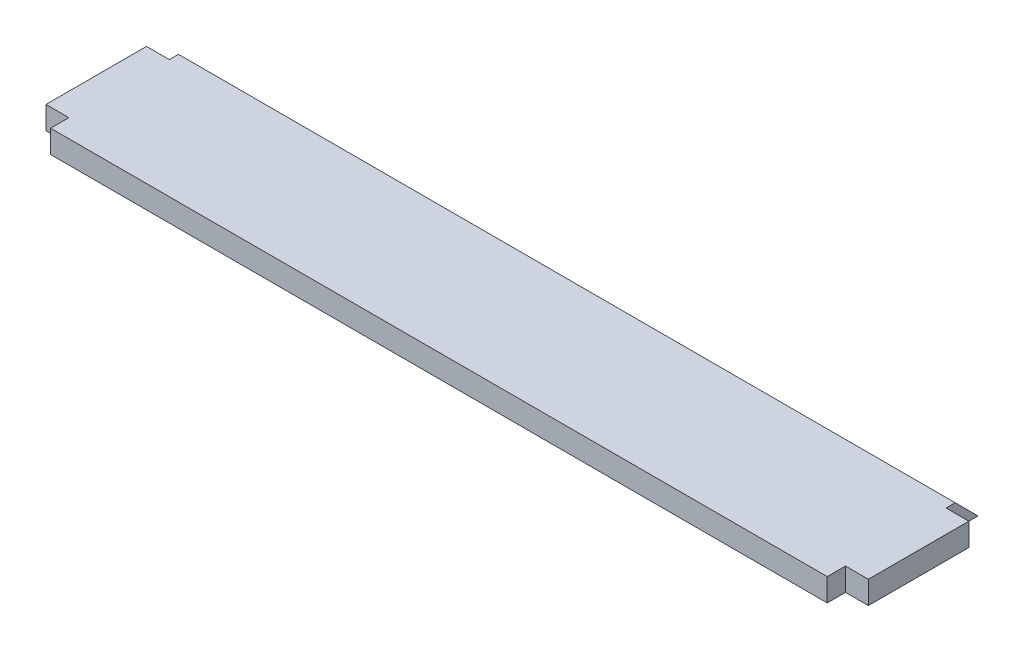
ISO-10303-21;
HEADER;
FILE_DESCRIPTION(('STEP AP214'),'2;1');
FILE_NAME('part.step','',(''),(''),'','','');
FILE_SCHEMA(('AUTOMOTIVE_DESIGN { 1 0 10303 214 1 1 1 1 }'));
ENDSEC;
DATA;
#1=APPLICATION_CONTEXT('core data for automotive mechanical design processes');
#2=APPLICATION_PROTOCOL_DEFINITION('international standard','automotive_design',2000,#1);
#3=PRODUCT_CONTEXT('',#1,'mechanical');
#4=PRODUCT('Part','Part','',(#3));
#5=PRODUCT_RELATED_PRODUCT_CATEGORY('part','',(#4));
#6=PRODUCT_DEFINITION_FORMATION('','',#4);
#7=PRODUCT_DEFINITION_CONTEXT('part definition',#1,'design');
#8=PRODUCT_DEFINITION('design','',#6,#7);
#9=PRODUCT_DEFINITION_SHAPE('','',#8);
#10=(LENGTH_UNIT() NAMED_UNIT(*) SI_UNIT(.MILLI.,.METRE.));
#11=(NAMED_UNIT(*) PLANE_ANGLE_UNIT() SI_UNIT($,.RADIAN.));
#12=(NAMED_UNIT(*) SI_UNIT($,.STERADIAN.) SOLID_ANGLE_UNIT());
#13=UNCERTAINTY_MEASURE_WITH_UNIT(LENGTH_MEASURE(1.E-05),#10,'distance_accuracy_value','');
#14=(GEOMETRIC_REPRESENTATION_CONTEXT(3) GLOBAL_UNCERTAINTY_ASSIGNED_CONTEXT((#13)) GLOBAL_UNIT_ASSIGNED_CONTEXT((#10,
#11,#12)) REPRESENTATION_CONTEXT('',''));
#15=CARTESIAN_POINT('',(0.,0.,0.));
#16=DIRECTION('',(0.,0.,1.));
#17=DIRECTION('',(1.,0.,0.));
#18=AXIS2_PLACEMENT_3D('',#15,#16,#17);
#19=CARTESIAN_POINT('',(85.,5.,-17.5));
#20=DIRECTION('',(-1.,0.,0.));
#21=DIRECTION('',(0.,0.,1.));
#22=AXIS2_PLACEMENT_3D('',#19,#20,#21);
#23=PLANE('',#22);
#24=DIRECTION('',(0.,0.,-1.));
#25=VECTOR('',#24,1.);
#26=CARTESIAN_POINT('',(85.,0.,-17.5));
#27=LINE('',#26,#25);
#28=CARTESIAN_POINT('',(85.,0.,-8.5));
#29=VERTEX_POINT('',#28);
#30=CARTESIAN_POINT('',(85.,0.,-15.5000000000001));
#31=VERTEX_POINT('',#30);
#32=EDGE_CURVE('E129',#29,#31,#27,.T.);
#33=ORIENTED_EDGE('',*,*,#32,.T.);
#34=DIRECTION('',(0.,-0.707106781186548,-0.707106781186546));
#35=VECTOR('',#34,1.);
#36=CARTESIAN_POINT('',(85.,5.,-10.5000000000001));
#37=LINE('',#36,#35);
#38=CARTESIAN_POINT('',(85.,5.,-10.5000000000001));
#39=VERTEX_POINT('',#38);
#40=EDGE_CURVE('E47',#39,#31,#37,.T.);
#41=ORIENTED_EDGE('',*,*,#40,.F.);
#42=DIRECTION('',(0.,0.,-1.));
#43=VECTOR('',#42,1.);
#44=CARTESIAN_POINT('',(85.,5.,-17.5));
#45=LINE('',#44,#43);
#46=CARTESIAN_POINT('',(85.,5.,-8.5));
#47=VERTEX_POINT('',#46);
#48=EDGE_CURVE('E54',#47,#39,#45,.T.);
#49=ORIENTED_EDGE('',*,*,#48,.F.);
#50=DIRECTION('',(0.,1.,0.));
#51=VECTOR('',#50,1.);
#52=CARTESIAN_POINT('',(85.,5.,-8.5));
#53=LINE('',#52,#51);
#54=EDGE_CURVE('E227',#29,#47,#53,.T.);
#55=ORIENTED_EDGE('',*,*,#54,.F.);
#56=EDGE_LOOP('',(#33,#41,#49,#55));
#57=FACE_BOUND('',#56,.T.);
#58=ADVANCED_FACE('F33',(#57),#23,.F.);
#59=DIRECTION('',(0.,-1.,0.));
#60=VECTOR('',#59,1.);
#61=CARTESIAN_POINT('',(85.,5.,13.5));
#62=LINE('',#61,#60);
#63=CARTESIAN_POINT('',(85.,5.,13.5));
#64=VERTEX_POINT('',#63);
#65=CARTESIAN_POINT('',(85.,0.,13.5));
#66=VERTEX_POINT('',#65);
#67=EDGE_CURVE('E229',#64,#66,#62,.T.);
#68=ORIENTED_EDGE('',*,*,#67,.F.);
#69=CARTESIAN_POINT('',(85.,5.,17.5));
#70=VERTEX_POINT('',#69);
#71=EDGE_CURVE('E135',#70,#64,#45,.T.);
#72=ORIENTED_EDGE('',*,*,#71,.F.);
#73=DIRECTION('',(0.,-1.,0.));
#74=VECTOR('',#73,1.);
#75=CARTESIAN_POINT('',(85.,5.,17.5));
#76=LINE('',#75,#74);
#77=CARTESIAN_POINT('',(85.,0.,17.5));
#78=VERTEX_POINT('',#77);
#79=EDGE_CURVE('E40',#70,#78,#76,.T.);
#80=ORIENTED_EDGE('',*,*,#79,.T.);
#81=EDGE_CURVE('E150',#78,#66,#27,.T.);
#82=ORIENTED_EDGE('',*,*,#81,.T.);
#83=EDGE_LOOP('',(#68,#72,#80,#82));
#84=FACE_BOUND('',#83,.T.);
#85=ADVANCED_FACE('F158',(#84),#23,.F.);
#86=CARTESIAN_POINT('',(-85.,5.,-17.5));
#87=DIRECTION('',(1.,0.,0.));
#88=DIRECTION('',(0.,0.,-1.));
#89=AXIS2_PLACEMENT_3D('',#86,#87,#88);
#90=PLANE('',#89);
#91=DIRECTION('',(0.,1.,0.));
#92=VECTOR('',#91,1.);
#93=CARTESIAN_POINT('',(-85.,0.,13.5));
#94=LINE('',#93,#92);
#95=CARTESIAN_POINT('',(-85.,0.,13.5));
#96=VERTEX_POINT('',#95);
#97=CARTESIAN_POINT('',(-85.,5.,13.5));
#98=VERTEX_POINT('',#97);
#99=EDGE_CURVE('E185',#96,#98,#94,.T.);
#100=ORIENTED_EDGE('',*,*,#99,.F.);
#101=DIRECTION('',(0.,0.,1.));
#102=VECTOR('',#101,1.);
#103=CARTESIAN_POINT('',(-85.,0.,-17.5));
#104=LINE('',#103,#102);
#105=CARTESIAN_POINT('',(-85.,0.,17.5));
#106=VERTEX_POINT('',#105);
#107=EDGE_CURVE('E152',#96,#106,#104,.T.);
#108=ORIENTED_EDGE('',*,*,#107,.T.);
#109=DIRECTION('',(0.,-1.,0.));
#110=VECTOR('',#109,1.);
#111=CARTESIAN_POINT('',(-85.,5.,17.5));
#112=LINE('',#111,#110);
#113=CARTESIAN_POINT('',(-85.,5.,17.5));
#114=VERTEX_POINT('',#113);
#115=EDGE_CURVE('E11',#114,#106,#112,.T.);
#116=ORIENTED_EDGE('',*,*,#115,.F.);
#117=DIRECTION('',(0.,0.,1.));
#118=VECTOR('',#117,1.);
#119=CARTESIAN_POINT('',(-85.,5.,-17.5));
#120=LINE('',#119,#118);
#121=EDGE_CURVE('E139',#98,#114,#120,.T.);
#122=ORIENTED_EDGE('',*,*,#121,.F.);
#123=EDGE_LOOP('',(#100,#108,#116,#122));
#124=FACE_BOUND('',#123,.T.);
#125=ADVANCED_FACE('F218',(#124),#90,.F.);
#126=CARTESIAN_POINT('',(-85.,5.,-10.5000000000001));
#127=VERTEX_POINT('',#126);
#128=CARTESIAN_POINT('',(-85.,5.,-8.5));
#129=VERTEX_POINT('',#128);
#130=EDGE_CURVE('E146',#127,#129,#120,.T.);
#131=ORIENTED_EDGE('',*,*,#130,.F.);
#132=DIRECTION('',(0.,-0.707106781186548,-0.707106781186547));
#133=VECTOR('',#132,1.);
#134=CARTESIAN_POINT('',(-85.,1.50000000000006,-14.0000000000001));
#135=LINE('',#134,#133);
#136=CARTESIAN_POINT('',(-85.,0.,-15.5000000000001));
#137=VERTEX_POINT('',#136);
#138=EDGE_CURVE('E122',#127,#137,#135,.T.);
#139=ORIENTED_EDGE('',*,*,#138,.T.);
#140=CARTESIAN_POINT('',(-85.,0.,-8.5));
#141=VERTEX_POINT('',#140);
#142=EDGE_CURVE('E140',#137,#141,#104,.T.);
#143=ORIENTED_EDGE('',*,*,#142,.T.);
#144=DIRECTION('',(0.,-1.,0.));
#145=VECTOR('',#144,1.);
#146=CARTESIAN_POINT('',(-85.,0.,-8.5));
#147=LINE('',#146,#145);
#148=EDGE_CURVE('E190',#129,#141,#147,.T.);
#149=ORIENTED_EDGE('',*,*,#148,.F.);
#150=EDGE_LOOP('',(#131,#139,#143,#149));
#151=FACE_BOUND('',#150,.T.);
#152=ADVANCED_FACE('F226',(#151),#90,.F.);
#153=CARTESIAN_POINT('',(-85.,5.,17.5));
#154=DIRECTION('',(0.,0.,-1.));
#155=DIRECTION('',(-1.,0.,0.));
#156=AXIS2_PLACEMENT_3D('',#153,#154,#155);
#157=PLANE('',#156);
#158=DIRECTION('',(1.,0.,0.));
#159=VECTOR('',#158,1.);
#160=CARTESIAN_POINT('',(-85.,0.,17.5));
#161=LINE('',#160,#159);
#162=EDGE_CURVE('E136',#106,#78,#161,.T.);
#163=ORIENTED_EDGE('',*,*,#162,.T.);
#164=ORIENTED_EDGE('',*,*,#79,.F.);
#165=DIRECTION('',(1.,0.,0.));
#166=VECTOR('',#165,1.);
#167=CARTESIAN_POINT('',(-85.,5.,17.5));
#168=LINE('',#167,#166);
#169=EDGE_CURVE('E148',#114,#70,#168,.T.);
#170=ORIENTED_EDGE('',*,*,#169,.F.);
#171=ORIENTED_EDGE('',*,*,#115,.T.);
#172=EDGE_LOOP('',(#163,#164,#170,#171));
#173=FACE_BOUND('',#172,.T.);
#174=ADVANCED_FACE('F242',(#173),#157,.F.);
#175=CARTESIAN_POINT('',(0.,5.,0.));
#176=DIRECTION('',(0.,1.,0.));
#177=DIRECTION('',(0.,0.,1.));
#178=AXIS2_PLACEMENT_3D('',#175,#176,#177);
#179=PLANE('',#178);
#180=DIRECTION('',(1.,0.,0.));
#181=VECTOR('',#180,1.);
#182=CARTESIAN_POINT('',(-478.,5.,-10.5000000000001));
#183=LINE('',#182,#181);
#184=EDGE_CURVE('E119',#127,#39,#183,.T.);
#185=ORIENTED_EDGE('',*,*,#184,.F.);
#186=ORIENTED_EDGE('',*,*,#130,.T.);
#187=DIRECTION('',(1.,0.,0.));
#188=VECTOR('',#187,1.);
#189=CARTESIAN_POINT('',(-90.,5.,-8.5));
#190=LINE('',#189,#188);
#191=CARTESIAN_POINT('',(-90.,5.,-8.5));
#192=VERTEX_POINT('',#191);
#193=EDGE_CURVE('E205',#192,#129,#190,.T.);
#194=ORIENTED_EDGE('',*,*,#193,.F.);
#195=DIRECTION('',(0.,0.,-1.));
#196=VECTOR('',#195,1.);
#197=CARTESIAN_POINT('',(-90.,5.,-8.5));
#198=LINE('',#197,#196);
#199=CARTESIAN_POINT('',(-90.,5.,13.5));
#200=VERTEX_POINT('',#199);
#201=EDGE_CURVE('E189',#200,#192,#198,.T.);
#202=ORIENTED_EDGE('',*,*,#201,.F.);
#203=DIRECTION('',(1.,0.,0.));
#204=VECTOR('',#203,1.);
#205=CARTESIAN_POINT('',(-90.,5.,13.5));
#206=LINE('',#205,#204);
#207=EDGE_CURVE('E144',#200,#98,#206,.T.);
#208=ORIENTED_EDGE('',*,*,#207,.T.);
#209=ORIENTED_EDGE('',*,*,#121,.T.);
#210=ORIENTED_EDGE('',*,*,#169,.T.);
#211=ORIENTED_EDGE('',*,*,#71,.T.);
#212=DIRECTION('',(-1.,0.,0.));
#213=VECTOR('',#212,1.);
#214=CARTESIAN_POINT('',(90.,5.,13.5));
#215=LINE('',#214,#213);
#216=CARTESIAN_POINT('',(90.,5.,13.5));
#217=VERTEX_POINT('',#216);
#218=EDGE_CURVE('E175',#217,#64,#215,.T.);
#219=ORIENTED_EDGE('',*,*,#218,.F.);
#220=DIRECTION('',(0.,0.,1.));
#221=VECTOR('',#220,1.);
#222=CARTESIAN_POINT('',(90.,5.,-8.5));
#223=LINE('',#222,#221);
#224=CARTESIAN_POINT('',(90.,5.,-8.5));
#225=VERTEX_POINT('',#224);
#226=EDGE_CURVE('E236',#225,#217,#223,.T.);
#227=ORIENTED_EDGE('',*,*,#226,.F.);
#228=DIRECTION('',(-1.,0.,0.));
#229=VECTOR('',#228,1.);
#230=CARTESIAN_POINT('',(90.,5.,-8.5));
#231=LINE('',#230,#229);
#232=EDGE_CURVE('E133',#225,#47,#231,.T.);
#233=ORIENTED_EDGE('',*,*,#232,.T.);
#234=ORIENTED_EDGE('',*,*,#48,.T.);
#235=EDGE_LOOP('',(#185,#186,#194,#202,#208,#209,#210,#211,#219,#227,#233,#234));
#236=FACE_BOUND('',#235,.T.);
#237=ADVANCED_FACE('F131',(#236),#179,.T.);
#238=CARTESIAN_POINT('',(0.,0.,0.));
#239=DIRECTION('',(0.,1.,0.));
#240=DIRECTION('',(0.,0.,1.));
#241=AXIS2_PLACEMENT_3D('',#238,#239,#240);
#242=PLANE('',#241);
#243=ORIENTED_EDGE('',*,*,#142,.F.);
#244=DIRECTION('',(1.,0.,0.));
#245=VECTOR('',#244,1.);
#246=CARTESIAN_POINT('',(-478.,0.,-15.5000000000001));
#247=LINE('',#246,#245);
#248=EDGE_CURVE('E125',#137,#31,#247,.T.);
#249=ORIENTED_EDGE('',*,*,#248,.T.);
#250=ORIENTED_EDGE('',*,*,#32,.F.);
#251=DIRECTION('',(-1.,0.,0.));
#252=VECTOR('',#251,1.);
#253=CARTESIAN_POINT('',(90.,0.,-8.5));
#254=LINE('',#253,#252);
#255=CARTESIAN_POINT('',(90.,0.,-8.5));
#256=VERTEX_POINT('',#255);
#257=EDGE_CURVE('E176',#256,#29,#254,.T.);
#258=ORIENTED_EDGE('',*,*,#257,.F.);
#259=DIRECTION('',(0.,0.,-1.));
#260=VECTOR('',#259,1.);
#261=CARTESIAN_POINT('',(90.,0.,-8.5));
#262=LINE('',#261,#260);
#263=CARTESIAN_POINT('',(90.,0.,13.5));
#264=VERTEX_POINT('',#263);
#265=EDGE_CURVE('E172',#264,#256,#262,.T.);
#266=ORIENTED_EDGE('',*,*,#265,.F.);
#267=DIRECTION('',(-1.,0.,0.));
#268=VECTOR('',#267,1.);
#269=CARTESIAN_POINT('',(90.,0.,13.5));
#270=LINE('',#269,#268);
#271=EDGE_CURVE('E170',#264,#66,#270,.T.);
#272=ORIENTED_EDGE('',*,*,#271,.T.);
#273=ORIENTED_EDGE('',*,*,#81,.F.);
#274=ORIENTED_EDGE('',*,*,#162,.F.);
#275=ORIENTED_EDGE('',*,*,#107,.F.);
#276=DIRECTION('',(1.,0.,0.));
#277=VECTOR('',#276,1.);
#278=CARTESIAN_POINT('',(-90.,0.,13.5));
#279=LINE('',#278,#277);
#280=CARTESIAN_POINT('',(-90.,0.,13.5));
#281=VERTEX_POINT('',#280);
#282=EDGE_CURVE('E196',#281,#96,#279,.T.);
#283=ORIENTED_EDGE('',*,*,#282,.F.);
#284=DIRECTION('',(0.,0.,1.));
#285=VECTOR('',#284,1.);
#286=CARTESIAN_POINT('',(-90.,0.,-8.5));
#287=LINE('',#286,#285);
#288=CARTESIAN_POINT('',(-90.,0.,-8.5));
#289=VERTEX_POINT('',#288);
#290=EDGE_CURVE('E194',#289,#281,#287,.T.);
#291=ORIENTED_EDGE('',*,*,#290,.F.);
#292=DIRECTION('',(1.,0.,0.));
#293=VECTOR('',#292,1.);
#294=CARTESIAN_POINT('',(-90.,0.,-8.5));
#295=LINE('',#294,#293);
#296=EDGE_CURVE('E203',#289,#141,#295,.T.);
#297=ORIENTED_EDGE('',*,*,#296,.T.);
#298=EDGE_LOOP('',(#243,#249,#250,#258,#266,#272,#273,#274,#275,#283,#291,#297));
#299=FACE_BOUND('',#298,.T.);
#300=ADVANCED_FACE('F166',(#299),#242,.F.);
#301=CARTESIAN_POINT('',(-90.,0.,13.5));
#302=DIRECTION('',(0.,0.,-1.));
#303=DIRECTION('',(0.,1.,0.));
#304=AXIS2_PLACEMENT_3D('',#301,#302,#303);
#305=PLANE('',#304);
#306=ORIENTED_EDGE('',*,*,#99,.T.);
#307=ORIENTED_EDGE('',*,*,#207,.F.);
#308=DIRECTION('',(0.,1.,0.));
#309=VECTOR('',#308,1.);
#310=CARTESIAN_POINT('',(-90.,0.,13.5));
#311=LINE('',#310,#309);
#312=EDGE_CURVE('E186',#281,#200,#311,.T.);
#313=ORIENTED_EDGE('',*,*,#312,.F.);
#314=ORIENTED_EDGE('',*,*,#282,.T.);
#315=EDGE_LOOP('',(#306,#307,#313,#314));
#316=FACE_BOUND('',#315,.T.);
#317=ADVANCED_FACE('F215',(#316),#305,.F.);
#318=CARTESIAN_POINT('',(-90.,0.,-8.5));
#319=DIRECTION('',(0.,0.,1.));
#320=DIRECTION('',(1.,0.,0.));
#321=AXIS2_PLACEMENT_3D('',#318,#319,#320);
#322=PLANE('',#321);
#323=ORIENTED_EDGE('',*,*,#148,.T.);
#324=ORIENTED_EDGE('',*,*,#296,.F.);
#325=DIRECTION('',(0.,-1.,0.));
#326=VECTOR('',#325,1.);
#327=CARTESIAN_POINT('',(-90.,0.,-8.5));
#328=LINE('',#327,#326);
#329=EDGE_CURVE('E192',#192,#289,#328,.T.);
#330=ORIENTED_EDGE('',*,*,#329,.F.);
#331=ORIENTED_EDGE('',*,*,#193,.T.);
#332=EDGE_LOOP('',(#323,#324,#330,#331));
#333=FACE_BOUND('',#332,.T.);
#334=ADVANCED_FACE('F223',(#333),#322,.F.);
#335=CARTESIAN_POINT('',(-90.,0.,0.));
#336=DIRECTION('',(1.,0.,0.));
#337=DIRECTION('',(0.,0.,-1.));
#338=AXIS2_PLACEMENT_3D('',#335,#336,#337);
#339=PLANE('',#338);
#340=ORIENTED_EDGE('',*,*,#312,.T.);
#341=ORIENTED_EDGE('',*,*,#201,.T.);
#342=ORIENTED_EDGE('',*,*,#329,.T.);
#343=ORIENTED_EDGE('',*,*,#290,.T.);
#344=EDGE_LOOP('',(#340,#341,#342,#343));
#345=FACE_BOUND('',#344,.T.);
#346=ADVANCED_FACE('F221',(#345),#339,.F.);
#347=CARTESIAN_POINT('',(90.,5.,-8.5));
#348=DIRECTION('',(0.,0.,1.));
#349=DIRECTION('',(1.,0.,0.));
#350=AXIS2_PLACEMENT_3D('',#347,#348,#349);
#351=PLANE('',#350);
#352=ORIENTED_EDGE('',*,*,#54,.T.);
#353=ORIENTED_EDGE('',*,*,#232,.F.);
#354=DIRECTION('',(0.,1.,0.));
#355=VECTOR('',#354,1.);
#356=CARTESIAN_POINT('',(90.,5.,-8.5));
#357=LINE('',#356,#355);
#358=EDGE_CURVE('E233',#256,#225,#357,.T.);
#359=ORIENTED_EDGE('',*,*,#358,.F.);
#360=ORIENTED_EDGE('',*,*,#257,.T.);
#361=EDGE_LOOP('',(#352,#353,#359,#360));
#362=FACE_BOUND('',#361,.T.);
#363=ADVANCED_FACE('F309',(#362),#351,.F.);
#364=CARTESIAN_POINT('',(90.,5.,13.5));
#365=DIRECTION('',(0.,0.,-1.));
#366=DIRECTION('',(-1.,0.,0.));
#367=AXIS2_PLACEMENT_3D('',#364,#365,#366);
#368=PLANE('',#367);
#369=ORIENTED_EDGE('',*,*,#67,.T.);
#370=ORIENTED_EDGE('',*,*,#271,.F.);
#371=DIRECTION('',(0.,-1.,0.));
#372=VECTOR('',#371,1.);
#373=CARTESIAN_POINT('',(90.,5.,13.5));
#374=LINE('',#373,#372);
#375=EDGE_CURVE('E238',#217,#264,#374,.T.);
#376=ORIENTED_EDGE('',*,*,#375,.F.);
#377=ORIENTED_EDGE('',*,*,#218,.T.);
#378=EDGE_LOOP('',(#369,#370,#376,#377));
#379=FACE_BOUND('',#378,.T.);
#380=ADVANCED_FACE('F240',(#379),#368,.F.);
#381=CARTESIAN_POINT('',(90.,0.,0.));
#382=DIRECTION('',(-1.,0.,0.));
#383=DIRECTION('',(0.,0.,1.));
#384=AXIS2_PLACEMENT_3D('',#381,#382,#383);
#385=PLANE('',#384);
#386=ORIENTED_EDGE('',*,*,#358,.T.);
#387=ORIENTED_EDGE('',*,*,#226,.T.);
#388=ORIENTED_EDGE('',*,*,#375,.T.);
#389=ORIENTED_EDGE('',*,*,#265,.T.);
#390=EDGE_LOOP('',(#386,#387,#388,#389));
#391=FACE_BOUND('',#390,.T.);
#392=ADVANCED_FACE('F294',(#391),#385,.F.);
#393=CARTESIAN_POINT('',(-478.,5.,-10.5000000000001));
#394=DIRECTION('',(0.,-0.707106781186547,0.707106781186548));
#395=DIRECTION('',(0.,-0.707106781186548,-0.707106781186547));
#396=AXIS2_PLACEMENT_3D('',#393,#394,#395);
#397=PLANE('',#396);
#398=ORIENTED_EDGE('',*,*,#184,.T.);
#399=ORIENTED_EDGE('',*,*,#40,.T.);
#400=ORIENTED_EDGE('',*,*,#248,.F.);
#401=ORIENTED_EDGE('',*,*,#138,.F.);
#402=EDGE_LOOP('',(#398,#399,#400,#401));
#403=FACE_BOUND('',#402,.T.);
#404=ADVANCED_FACE('F120',(#403),#397,.F.);
#405=CLOSED_SHELL('',(#58,#85,#125,#152,#174,#237,#300,#317,#334,#346,#363,#380,#392,#404));
#406=MANIFOLD_SOLID_BREP('B2',#405);
#407=ADVANCED_BREP_SHAPE_REPRESENTATION('',(#18,#406),#14);
#408=SHAPE_DEFINITION_REPRESENTATION(#9,#407);
ENDSEC;
END-ISO-10303-21;
